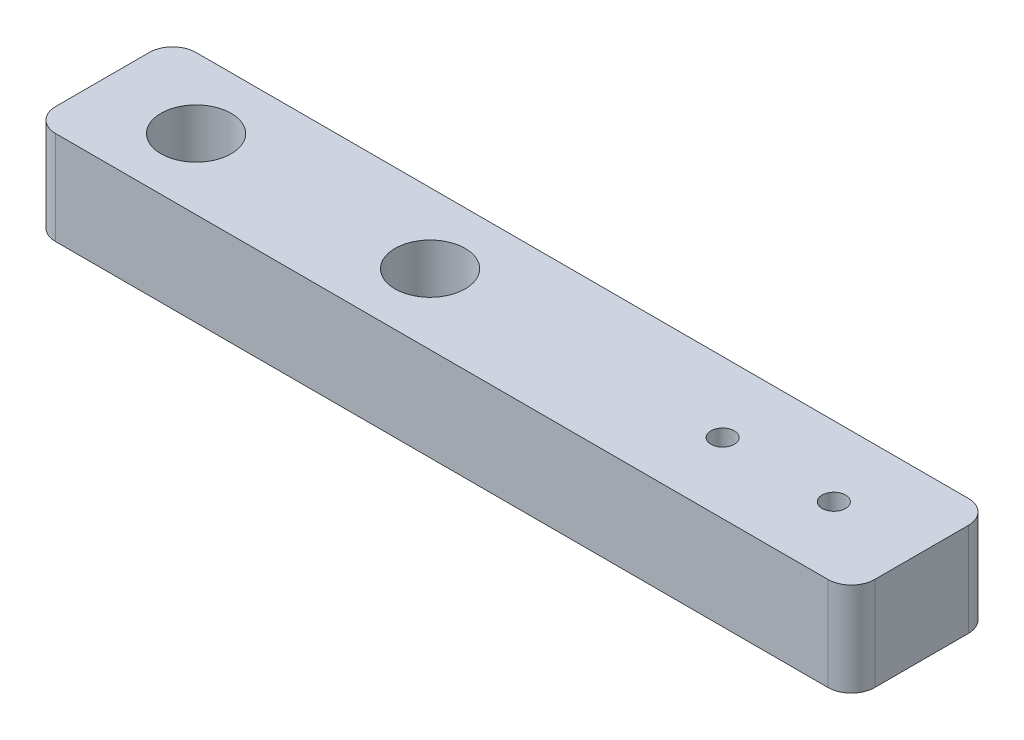
ISO-10303-21;
HEADER;
FILE_DESCRIPTION(('STEP AP214'),'2;1');
FILE_NAME('part.step','',(''),(''),'','','');
FILE_SCHEMA(('AUTOMOTIVE_DESIGN { 1 0 10303 214 1 1 1 1 }'));
ENDSEC;
DATA;
#1=APPLICATION_CONTEXT('core data for automotive mechanical design processes');
#2=APPLICATION_PROTOCOL_DEFINITION('international standard','automotive_design',2000,#1);
#3=PRODUCT_CONTEXT('',#1,'mechanical');
#4=PRODUCT('Part','Part','',(#3));
#5=PRODUCT_RELATED_PRODUCT_CATEGORY('part','',(#4));
#6=PRODUCT_DEFINITION_FORMATION('','',#4);
#7=PRODUCT_DEFINITION_CONTEXT('part definition',#1,'design');
#8=PRODUCT_DEFINITION('design','',#6,#7);
#9=PRODUCT_DEFINITION_SHAPE('','',#8);
#10=(LENGTH_UNIT() NAMED_UNIT(*) SI_UNIT(.MILLI.,.METRE.));
#11=(NAMED_UNIT(*) PLANE_ANGLE_UNIT() SI_UNIT($,.RADIAN.));
#12=(NAMED_UNIT(*) SI_UNIT($,.STERADIAN.) SOLID_ANGLE_UNIT());
#13=UNCERTAINTY_MEASURE_WITH_UNIT(LENGTH_MEASURE(1.E-05),#10,'distance_accuracy_value','');
#14=(GEOMETRIC_REPRESENTATION_CONTEXT(3) GLOBAL_UNCERTAINTY_ASSIGNED_CONTEXT((#13)) GLOBAL_UNIT_ASSIGNED_CONTEXT((#10,
#11,#12)) REPRESENTATION_CONTEXT('',''));
#15=CARTESIAN_POINT('',(0.,0.,0.));
#16=DIRECTION('',(0.,0.,1.));
#17=DIRECTION('',(1.,0.,0.));
#18=AXIS2_PLACEMENT_3D('',#15,#16,#17);
#19=CARTESIAN_POINT('',(35.,8.,6.));
#20=DIRECTION('',(-1.,0.,0.));
#21=DIRECTION('',(0.,0.,1.));
#22=AXIS2_PLACEMENT_3D('',#19,#20,#21);
#23=PLANE('',#22);
#24=DIRECTION('',(0.,0.,-1.));
#25=VECTOR('',#24,1.);
#26=CARTESIAN_POINT('',(35.,0.,6.));
#27=LINE('',#26,#25);
#28=CARTESIAN_POINT('',(35.,0.,4.));
#29=VERTEX_POINT('',#28);
#30=CARTESIAN_POINT('',(35.,0.,-4.));
#31=VERTEX_POINT('',#30);
#32=EDGE_CURVE('E140',#29,#31,#27,.T.);
#33=ORIENTED_EDGE('',*,*,#32,.T.);
#34=DIRECTION('',(0.,-1.,0.));
#35=VECTOR('',#34,1.);
#36=CARTESIAN_POINT('',(35.,8.,-4.));
#37=LINE('',#36,#35);
#38=CARTESIAN_POINT('',(35.,8.,-4.));
#39=VERTEX_POINT('',#38);
#40=EDGE_CURVE('E174',#31,#39,#37,.F.);
#41=ORIENTED_EDGE('',*,*,#40,.T.);
#42=DIRECTION('',(0.,0.,-1.));
#43=VECTOR('',#42,1.);
#44=CARTESIAN_POINT('',(35.,8.,6.));
#45=LINE('',#44,#43);
#46=CARTESIAN_POINT('',(35.,8.,4.));
#47=VERTEX_POINT('',#46);
#48=EDGE_CURVE('E138',#47,#39,#45,.T.);
#49=ORIENTED_EDGE('',*,*,#48,.F.);
#50=DIRECTION('',(0.,-1.,0.));
#51=VECTOR('',#50,1.);
#52=CARTESIAN_POINT('',(35.,8.,4.));
#53=LINE('',#52,#51);
#54=EDGE_CURVE('E170',#47,#29,#53,.T.);
#55=ORIENTED_EDGE('',*,*,#54,.T.);
#56=EDGE_LOOP('',(#33,#41,#49,#55));
#57=FACE_BOUND('',#56,.T.);
#58=ADVANCED_FACE('F39',(#57),#23,.F.);
#59=CARTESIAN_POINT('',(-35.,8.,-6.));
#60=DIRECTION('',(0.,0.,1.));
#61=DIRECTION('',(1.,0.,0.));
#62=AXIS2_PLACEMENT_3D('',#59,#60,#61);
#63=PLANE('',#62);
#64=DIRECTION('',(-1.,0.,0.));
#65=VECTOR('',#64,1.);
#66=CARTESIAN_POINT('',(-35.,0.,-6.));
#67=LINE('',#66,#65);
#68=CARTESIAN_POINT('',(33.,0.,-6.));
#69=VERTEX_POINT('',#68);
#70=CARTESIAN_POINT('',(-33.,0.,-6.));
#71=VERTEX_POINT('',#70);
#72=EDGE_CURVE('E134',#69,#71,#67,.T.);
#73=ORIENTED_EDGE('',*,*,#72,.T.);
#74=DIRECTION('',(0.,-1.,0.));
#75=VECTOR('',#74,1.);
#76=CARTESIAN_POINT('',(-33.,8.,-6.));
#77=LINE('',#76,#75);
#78=CARTESIAN_POINT('',(-33.,8.,-6.));
#79=VERTEX_POINT('',#78);
#80=EDGE_CURVE('E110',#71,#79,#77,.F.);
#81=ORIENTED_EDGE('',*,*,#80,.T.);
#82=DIRECTION('',(-1.,0.,0.));
#83=VECTOR('',#82,1.);
#84=CARTESIAN_POINT('',(-35.,8.,-6.));
#85=LINE('',#84,#83);
#86=CARTESIAN_POINT('',(33.,8.,-6.));
#87=VERTEX_POINT('',#86);
#88=EDGE_CURVE('E193',#87,#79,#85,.T.);
#89=ORIENTED_EDGE('',*,*,#88,.F.);
#90=DIRECTION('',(0.,-1.,0.));
#91=VECTOR('',#90,1.);
#92=CARTESIAN_POINT('',(33.,8.,-6.));
#93=LINE('',#92,#91);
#94=EDGE_CURVE('E116',#87,#69,#93,.T.);
#95=ORIENTED_EDGE('',*,*,#94,.T.);
#96=EDGE_LOOP('',(#73,#81,#89,#95));
#97=FACE_BOUND('',#96,.T.);
#98=ADVANCED_FACE('F250',(#97),#63,.F.);
#99=CARTESIAN_POINT('',(-35.,8.,6.));
#100=DIRECTION('',(1.,0.,0.));
#101=DIRECTION('',(0.,0.,-1.));
#102=AXIS2_PLACEMENT_3D('',#99,#100,#101);
#103=PLANE('',#102);
#104=DIRECTION('',(0.,0.,1.));
#105=VECTOR('',#104,1.);
#106=CARTESIAN_POINT('',(-35.,8.,6.));
#107=LINE('',#106,#105);
#108=CARTESIAN_POINT('',(-35.,8.,-4.));
#109=VERTEX_POINT('',#108);
#110=CARTESIAN_POINT('',(-35.,8.,4.));
#111=VERTEX_POINT('',#110);
#112=EDGE_CURVE('E125',#109,#111,#107,.T.);
#113=ORIENTED_EDGE('',*,*,#112,.F.);
#114=DIRECTION('',(0.,-1.,0.));
#115=VECTOR('',#114,1.);
#116=CARTESIAN_POINT('',(-35.,8.,-4.));
#117=LINE('',#116,#115);
#118=CARTESIAN_POINT('',(-35.,0.,-4.));
#119=VERTEX_POINT('',#118);
#120=EDGE_CURVE('E109',#109,#119,#117,.T.);
#121=ORIENTED_EDGE('',*,*,#120,.T.);
#122=DIRECTION('',(0.,0.,1.));
#123=VECTOR('',#122,1.);
#124=CARTESIAN_POINT('',(-35.,0.,6.));
#125=LINE('',#124,#123);
#126=CARTESIAN_POINT('',(-35.,0.,4.));
#127=VERTEX_POINT('',#126);
#128=EDGE_CURVE('E123',#119,#127,#125,.T.);
#129=ORIENTED_EDGE('',*,*,#128,.T.);
#130=DIRECTION('',(0.,-1.,0.));
#131=VECTOR('',#130,1.);
#132=CARTESIAN_POINT('',(-35.,8.,4.));
#133=LINE('',#132,#131);
#134=EDGE_CURVE('E128',#127,#111,#133,.F.);
#135=ORIENTED_EDGE('',*,*,#134,.T.);
#136=EDGE_LOOP('',(#113,#121,#129,#135));
#137=FACE_BOUND('',#136,.T.);
#138=ADVANCED_FACE('F122',(#137),#103,.F.);
#139=CARTESIAN_POINT('',(-35.,8.,6.));
#140=DIRECTION('',(0.,0.,-1.));
#141=DIRECTION('',(-1.,0.,0.));
#142=AXIS2_PLACEMENT_3D('',#139,#140,#141);
#143=PLANE('',#142);
#144=DIRECTION('',(1.,0.,0.));
#145=VECTOR('',#144,1.);
#146=CARTESIAN_POINT('',(-35.,0.,6.));
#147=LINE('',#146,#145);
#148=CARTESIAN_POINT('',(-33.,0.,6.));
#149=VERTEX_POINT('',#148);
#150=CARTESIAN_POINT('',(33.,0.,6.));
#151=VERTEX_POINT('',#150);
#152=EDGE_CURVE('E133',#149,#151,#147,.T.);
#153=ORIENTED_EDGE('',*,*,#152,.T.);
#154=DIRECTION('',(0.,-1.,0.));
#155=VECTOR('',#154,1.);
#156=CARTESIAN_POINT('',(33.,8.,6.));
#157=LINE('',#156,#155);
#158=CARTESIAN_POINT('',(33.,8.,6.));
#159=VERTEX_POINT('',#158);
#160=EDGE_CURVE('E11',#151,#159,#157,.F.);
#161=ORIENTED_EDGE('',*,*,#160,.T.);
#162=DIRECTION('',(1.,0.,0.));
#163=VECTOR('',#162,1.);
#164=CARTESIAN_POINT('',(-35.,8.,6.));
#165=LINE('',#164,#163);
#166=CARTESIAN_POINT('',(-33.,8.,6.));
#167=VERTEX_POINT('',#166);
#168=EDGE_CURVE('E145',#167,#159,#165,.T.);
#169=ORIENTED_EDGE('',*,*,#168,.F.);
#170=DIRECTION('',(0.,-1.,0.));
#171=VECTOR('',#170,1.);
#172=CARTESIAN_POINT('',(-33.,8.,6.));
#173=LINE('',#172,#171);
#174=EDGE_CURVE('E48',#167,#149,#173,.T.);
#175=ORIENTED_EDGE('',*,*,#174,.T.);
#176=EDGE_LOOP('',(#153,#161,#169,#175));
#177=FACE_BOUND('',#176,.T.);
#178=ADVANCED_FACE('F179',(#177),#143,.F.);
#179=CARTESIAN_POINT('',(0.,8.,0.));
#180=DIRECTION('',(0.,-1.,0.));
#181=DIRECTION('',(0.,0.,-1.));
#182=AXIS2_PLACEMENT_3D('',#179,#180,#181);
#183=PLANE('',#182);
#184=CARTESIAN_POINT('',(-27.,8.,0.));
#185=DIRECTION('',(0.,1.,0.));
#186=DIRECTION('',(0.,0.,1.));
#187=AXIS2_PLACEMENT_3D('',#184,#185,#186);
#188=CIRCLE('',#187,3.);
#189=CARTESIAN_POINT('',(-27.,8.,3.));
#190=VERTEX_POINT('',#189);
#191=EDGE_CURVE('E209',#190,#190,#188,.T.);
#192=ORIENTED_EDGE('',*,*,#191,.F.);
#193=EDGE_LOOP('',(#192));
#194=FACE_BOUND('',#193,.T.);
#195=CARTESIAN_POINT('',(-7.,8.,0.));
#196=DIRECTION('',(0.,1.,0.));
#197=DIRECTION('',(0.,0.,1.));
#198=AXIS2_PLACEMENT_3D('',#195,#196,#197);
#199=CIRCLE('',#198,3.);
#200=CARTESIAN_POINT('',(-7.,8.,3.));
#201=VERTEX_POINT('',#200);
#202=EDGE_CURVE('E221',#201,#201,#199,.T.);
#203=ORIENTED_EDGE('',*,*,#202,.F.);
#204=EDGE_LOOP('',(#203));
#205=FACE_BOUND('',#204,.T.);
#206=CARTESIAN_POINT('',(18.,8.,0.));
#207=DIRECTION('',(0.,1.,0.));
#208=DIRECTION('',(0.,0.,1.));
#209=AXIS2_PLACEMENT_3D('',#206,#207,#208);
#210=CIRCLE('',#209,1.);
#211=CARTESIAN_POINT('',(18.,8.,1.));
#212=VERTEX_POINT('',#211);
#213=EDGE_CURVE('E229',#212,#212,#210,.T.);
#214=ORIENTED_EDGE('',*,*,#213,.F.);
#215=EDGE_LOOP('',(#214));
#216=FACE_BOUND('',#215,.T.);
#217=CARTESIAN_POINT('',(27.5,8.,0.));
#218=DIRECTION('',(0.,1.,0.));
#219=DIRECTION('',(0.,0.,1.));
#220=AXIS2_PLACEMENT_3D('',#217,#218,#219);
#221=CIRCLE('',#220,0.999999999999998);
#222=CARTESIAN_POINT('',(27.5,8.,0.999999999999998));
#223=VERTEX_POINT('',#222);
#224=EDGE_CURVE('E199',#223,#223,#221,.T.);
#225=ORIENTED_EDGE('',*,*,#224,.F.);
#226=EDGE_LOOP('',(#225));
#227=FACE_BOUND('',#226,.T.);
#228=ORIENTED_EDGE('',*,*,#88,.T.);
#229=CARTESIAN_POINT('',(-33.,8.,-4.));
#230=DIRECTION('',(0.,-1.,0.));
#231=DIRECTION('',(0.,0.,-1.));
#232=AXIS2_PLACEMENT_3D('',#229,#230,#231);
#233=CIRCLE('',#232,2.);
#234=EDGE_CURVE('E167',#79,#109,#233,.F.);
#235=ORIENTED_EDGE('',*,*,#234,.T.);
#236=ORIENTED_EDGE('',*,*,#112,.T.);
#237=CARTESIAN_POINT('',(-33.,8.,4.));
#238=DIRECTION('',(0.,-1.,0.));
#239=DIRECTION('',(0.,0.,-1.));
#240=AXIS2_PLACEMENT_3D('',#237,#238,#239);
#241=CIRCLE('',#240,2.);
#242=EDGE_CURVE('E60',#111,#167,#241,.F.);
#243=ORIENTED_EDGE('',*,*,#242,.T.);
#244=ORIENTED_EDGE('',*,*,#168,.T.);
#245=CARTESIAN_POINT('',(33.,8.,4.));
#246=DIRECTION('',(0.,-1.,0.));
#247=DIRECTION('',(0.,0.,-1.));
#248=AXIS2_PLACEMENT_3D('',#245,#246,#247);
#249=CIRCLE('',#248,2.);
#250=EDGE_CURVE('E161',#159,#47,#249,.F.);
#251=ORIENTED_EDGE('',*,*,#250,.T.);
#252=ORIENTED_EDGE('',*,*,#48,.T.);
#253=CARTESIAN_POINT('',(33.,8.,-4.));
#254=DIRECTION('',(0.,-1.,0.));
#255=DIRECTION('',(0.,0.,-1.));
#256=AXIS2_PLACEMENT_3D('',#253,#254,#255);
#257=CIRCLE('',#256,2.);
#258=EDGE_CURVE('E164',#39,#87,#257,.F.);
#259=ORIENTED_EDGE('',*,*,#258,.T.);
#260=EDGE_LOOP('',(#228,#235,#236,#243,#244,#251,#252,#259));
#261=FACE_BOUND('',#260,.T.);
#262=ADVANCED_FACE('F243',(#194,#205,#216,#227,#261),#183,.F.);
#263=CARTESIAN_POINT('',(0.,0.,0.));
#264=DIRECTION('',(0.,-1.,0.));
#265=DIRECTION('',(0.,0.,-1.));
#266=AXIS2_PLACEMENT_3D('',#263,#264,#265);
#267=PLANE('',#266);
#268=CARTESIAN_POINT('',(-27.,0.,0.));
#269=DIRECTION('',(0.,1.,0.));
#270=DIRECTION('',(0.,0.,1.));
#271=AXIS2_PLACEMENT_3D('',#268,#269,#270);
#272=CIRCLE('',#271,3.);
#273=CARTESIAN_POINT('',(-27.,0.,3.));
#274=VERTEX_POINT('',#273);
#275=EDGE_CURVE('E206',#274,#274,#272,.T.);
#276=ORIENTED_EDGE('',*,*,#275,.T.);
#277=EDGE_LOOP('',(#276));
#278=FACE_BOUND('',#277,.T.);
#279=CARTESIAN_POINT('',(-7.,0.,0.));
#280=DIRECTION('',(0.,1.,0.));
#281=DIRECTION('',(0.,0.,1.));
#282=AXIS2_PLACEMENT_3D('',#279,#280,#281);
#283=CIRCLE('',#282,3.);
#284=CARTESIAN_POINT('',(-7.,0.,3.));
#285=VERTEX_POINT('',#284);
#286=EDGE_CURVE('E215',#285,#285,#283,.T.);
#287=ORIENTED_EDGE('',*,*,#286,.T.);
#288=EDGE_LOOP('',(#287));
#289=FACE_BOUND('',#288,.T.);
#290=CARTESIAN_POINT('',(18.,0.,0.));
#291=DIRECTION('',(0.,1.,0.));
#292=DIRECTION('',(0.,0.,1.));
#293=AXIS2_PLACEMENT_3D('',#290,#291,#292);
#294=CIRCLE('',#293,1.);
#295=CARTESIAN_POINT('',(18.,0.,1.));
#296=VERTEX_POINT('',#295);
#297=EDGE_CURVE('E225',#296,#296,#294,.T.);
#298=ORIENTED_EDGE('',*,*,#297,.T.);
#299=EDGE_LOOP('',(#298));
#300=FACE_BOUND('',#299,.T.);
#301=CARTESIAN_POINT('',(27.5,0.,0.));
#302=DIRECTION('',(0.,1.,0.));
#303=DIRECTION('',(0.,0.,1.));
#304=AXIS2_PLACEMENT_3D('',#301,#302,#303);
#305=CIRCLE('',#304,0.999999999999998);
#306=CARTESIAN_POINT('',(27.5,0.,0.999999999999998));
#307=VERTEX_POINT('',#306);
#308=EDGE_CURVE('E232',#307,#307,#305,.T.);
#309=ORIENTED_EDGE('',*,*,#308,.T.);
#310=EDGE_LOOP('',(#309));
#311=FACE_BOUND('',#310,.T.);
#312=ORIENTED_EDGE('',*,*,#128,.F.);
#313=CARTESIAN_POINT('',(-33.,0.,-4.));
#314=DIRECTION('',(0.,-1.,0.));
#315=DIRECTION('',(0.,0.,-1.));
#316=AXIS2_PLACEMENT_3D('',#313,#314,#315);
#317=CIRCLE('',#316,2.);
#318=EDGE_CURVE('E105',#119,#71,#317,.T.);
#319=ORIENTED_EDGE('',*,*,#318,.T.);
#320=ORIENTED_EDGE('',*,*,#72,.F.);
#321=CARTESIAN_POINT('',(33.,0.,-4.));
#322=DIRECTION('',(0.,-1.,0.));
#323=DIRECTION('',(0.,0.,-1.));
#324=AXIS2_PLACEMENT_3D('',#321,#322,#323);
#325=CIRCLE('',#324,2.);
#326=EDGE_CURVE('E117',#69,#31,#325,.T.);
#327=ORIENTED_EDGE('',*,*,#326,.T.);
#328=ORIENTED_EDGE('',*,*,#32,.F.);
#329=CARTESIAN_POINT('',(33.,0.,4.));
#330=DIRECTION('',(0.,-1.,0.));
#331=DIRECTION('',(0.,0.,-1.));
#332=AXIS2_PLACEMENT_3D('',#329,#330,#331);
#333=CIRCLE('',#332,2.);
#334=EDGE_CURVE('E149',#29,#151,#333,.T.);
#335=ORIENTED_EDGE('',*,*,#334,.T.);
#336=ORIENTED_EDGE('',*,*,#152,.F.);
#337=CARTESIAN_POINT('',(-33.,0.,4.));
#338=DIRECTION('',(0.,-1.,0.));
#339=DIRECTION('',(0.,0.,-1.));
#340=AXIS2_PLACEMENT_3D('',#337,#338,#339);
#341=CIRCLE('',#340,2.);
#342=EDGE_CURVE('E127',#149,#127,#341,.T.);
#343=ORIENTED_EDGE('',*,*,#342,.T.);
#344=EDGE_LOOP('',(#312,#319,#320,#327,#328,#335,#336,#343));
#345=FACE_BOUND('',#344,.T.);
#346=ADVANCED_FACE('F130',(#278,#289,#300,#311,#345),#267,.T.);
#347=CARTESIAN_POINT('',(27.5,0.,0.));
#348=DIRECTION('',(0.,1.,0.));
#349=DIRECTION('',(0.,0.,1.));
#350=AXIS2_PLACEMENT_3D('',#347,#348,#349);
#351=CYLINDRICAL_SURFACE('',#350,0.999999999999998);
#352=ORIENTED_EDGE('',*,*,#308,.F.);
#353=EDGE_LOOP('',(#352));
#354=FACE_BOUND('',#353,.T.);
#355=ORIENTED_EDGE('',*,*,#224,.T.);
#356=EDGE_LOOP('',(#355));
#357=FACE_BOUND('',#356,.T.);
#358=ADVANCED_FACE('F241',(#354,#357),#351,.F.);
#359=CARTESIAN_POINT('',(18.,0.,0.));
#360=DIRECTION('',(0.,1.,0.));
#361=DIRECTION('',(0.,0.,1.));
#362=AXIS2_PLACEMENT_3D('',#359,#360,#361);
#363=CYLINDRICAL_SURFACE('',#362,1.);
#364=ORIENTED_EDGE('',*,*,#297,.F.);
#365=EDGE_LOOP('',(#364));
#366=FACE_BOUND('',#365,.T.);
#367=ORIENTED_EDGE('',*,*,#213,.T.);
#368=EDGE_LOOP('',(#367));
#369=FACE_BOUND('',#368,.T.);
#370=ADVANCED_FACE('F276',(#366,#369),#363,.F.);
#371=CARTESIAN_POINT('',(-7.,0.,0.));
#372=DIRECTION('',(0.,1.,0.));
#373=DIRECTION('',(0.,0.,1.));
#374=AXIS2_PLACEMENT_3D('',#371,#372,#373);
#375=CYLINDRICAL_SURFACE('',#374,3.);
#376=ORIENTED_EDGE('',*,*,#286,.F.);
#377=EDGE_LOOP('',(#376));
#378=FACE_BOUND('',#377,.T.);
#379=ORIENTED_EDGE('',*,*,#202,.T.);
#380=EDGE_LOOP('',(#379));
#381=FACE_BOUND('',#380,.T.);
#382=ADVANCED_FACE('F280',(#378,#381),#375,.F.);
#383=CARTESIAN_POINT('',(-27.,0.,0.));
#384=DIRECTION('',(0.,1.,0.));
#385=DIRECTION('',(0.,0.,1.));
#386=AXIS2_PLACEMENT_3D('',#383,#384,#385);
#387=CYLINDRICAL_SURFACE('',#386,3.);
#388=ORIENTED_EDGE('',*,*,#275,.F.);
#389=EDGE_LOOP('',(#388));
#390=FACE_BOUND('',#389,.T.);
#391=ORIENTED_EDGE('',*,*,#191,.T.);
#392=EDGE_LOOP('',(#391));
#393=FACE_BOUND('',#392,.T.);
#394=ADVANCED_FACE('F259',(#390,#393),#387,.F.);
#395=CARTESIAN_POINT('',(-33.,8.,-4.));
#396=DIRECTION('',(0.,-1.,0.));
#397=DIRECTION('',(0.,0.,-1.));
#398=AXIS2_PLACEMENT_3D('',#395,#396,#397);
#399=CYLINDRICAL_SURFACE('',#398,2.);
#400=ORIENTED_EDGE('',*,*,#234,.F.);
#401=ORIENTED_EDGE('',*,*,#80,.F.);
#402=ORIENTED_EDGE('',*,*,#318,.F.);
#403=ORIENTED_EDGE('',*,*,#120,.F.);
#404=EDGE_LOOP('',(#400,#401,#402,#403));
#405=FACE_BOUND('',#404,.T.);
#406=ADVANCED_FACE('F108',(#405),#399,.T.);
#407=CARTESIAN_POINT('',(33.,8.,-4.));
#408=DIRECTION('',(0.,-1.,0.));
#409=DIRECTION('',(0.,0.,-1.));
#410=AXIS2_PLACEMENT_3D('',#407,#408,#409);
#411=CYLINDRICAL_SURFACE('',#410,2.);
#412=ORIENTED_EDGE('',*,*,#258,.F.);
#413=ORIENTED_EDGE('',*,*,#40,.F.);
#414=ORIENTED_EDGE('',*,*,#326,.F.);
#415=ORIENTED_EDGE('',*,*,#94,.F.);
#416=EDGE_LOOP('',(#412,#413,#414,#415));
#417=FACE_BOUND('',#416,.T.);
#418=ADVANCED_FACE('F252',(#417),#411,.T.);
#419=CARTESIAN_POINT('',(33.,8.,4.));
#420=DIRECTION('',(0.,-1.,0.));
#421=DIRECTION('',(0.,0.,-1.));
#422=AXIS2_PLACEMENT_3D('',#419,#420,#421);
#423=CYLINDRICAL_SURFACE('',#422,2.);
#424=ORIENTED_EDGE('',*,*,#250,.F.);
#425=ORIENTED_EDGE('',*,*,#160,.F.);
#426=ORIENTED_EDGE('',*,*,#334,.F.);
#427=ORIENTED_EDGE('',*,*,#54,.F.);
#428=EDGE_LOOP('',(#424,#425,#426,#427));
#429=FACE_BOUND('',#428,.T.);
#430=ADVANCED_FACE('F186',(#429),#423,.T.);
#431=CARTESIAN_POINT('',(-33.,8.,4.));
#432=DIRECTION('',(0.,-1.,0.));
#433=DIRECTION('',(0.,0.,-1.));
#434=AXIS2_PLACEMENT_3D('',#431,#432,#433);
#435=CYLINDRICAL_SURFACE('',#434,2.);
#436=ORIENTED_EDGE('',*,*,#242,.F.);
#437=ORIENTED_EDGE('',*,*,#134,.F.);
#438=ORIENTED_EDGE('',*,*,#342,.F.);
#439=ORIENTED_EDGE('',*,*,#174,.F.);
#440=EDGE_LOOP('',(#436,#437,#438,#439));
#441=FACE_BOUND('',#440,.T.);
#442=ADVANCED_FACE('F41',(#441),#435,.T.);
#443=CLOSED_SHELL('',(#58,#98,#138,#178,#262,#346,#358,#370,#382,#394,#406,#418,#430,#442));
#444=MANIFOLD_SOLID_BREP('B2',#443);
#445=ADVANCED_BREP_SHAPE_REPRESENTATION('',(#18,#444),#14);
#446=SHAPE_DEFINITION_REPRESENTATION(#9,#445);
ENDSEC;
END-ISO-10303-21;
